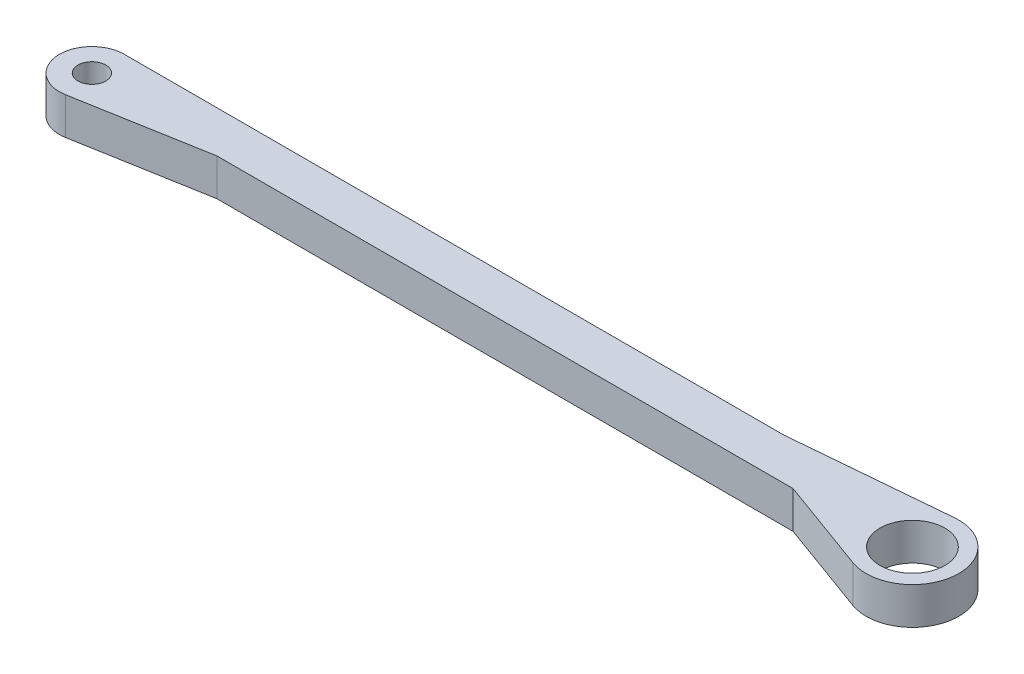
ISO-10303-21;
HEADER;
FILE_DESCRIPTION(('STEP AP214'),'2;1');
FILE_NAME('part.step','',(''),(''),'','','');
FILE_SCHEMA(('AUTOMOTIVE_DESIGN { 1 0 10303 214 1 1 1 1 }'));
ENDSEC;
DATA;
#1=APPLICATION_CONTEXT('core data for automotive mechanical design processes');
#2=APPLICATION_PROTOCOL_DEFINITION('international standard','automotive_design',2000,#1);
#3=PRODUCT_CONTEXT('',#1,'mechanical');
#4=PRODUCT('Part','Part','',(#3));
#5=PRODUCT_RELATED_PRODUCT_CATEGORY('part','',(#4));
#6=PRODUCT_DEFINITION_FORMATION('','',#4);
#7=PRODUCT_DEFINITION_CONTEXT('part definition',#1,'design');
#8=PRODUCT_DEFINITION('design','',#6,#7);
#9=PRODUCT_DEFINITION_SHAPE('','',#8);
#10=(LENGTH_UNIT() NAMED_UNIT(*) SI_UNIT(.MILLI.,.METRE.));
#11=(NAMED_UNIT(*) PLANE_ANGLE_UNIT() SI_UNIT($,.RADIAN.));
#12=(NAMED_UNIT(*) SI_UNIT($,.STERADIAN.) SOLID_ANGLE_UNIT());
#13=UNCERTAINTY_MEASURE_WITH_UNIT(LENGTH_MEASURE(1.E-05),#10,'distance_accuracy_value','');
#14=(GEOMETRIC_REPRESENTATION_CONTEXT(3) GLOBAL_UNCERTAINTY_ASSIGNED_CONTEXT((#13)) GLOBAL_UNIT_ASSIGNED_CONTEXT((#10,
#11,#12)) REPRESENTATION_CONTEXT('',''));
#15=CARTESIAN_POINT('',(0.,0.,0.));
#16=DIRECTION('',(0.,0.,1.));
#17=DIRECTION('',(1.,0.,0.));
#18=AXIS2_PLACEMENT_3D('',#15,#16,#17);
#19=CARTESIAN_POINT('',(17.2848653507131,8.,-47.4897772493988));
#20=DIRECTION('',(-0.342020143325663,0.,0.939692620785911));
#21=DIRECTION('',(0.939692620785911,0.,0.342020143325663));
#22=AXIS2_PLACEMENT_3D('',#19,#20,#21);
#23=PLANE('',#22);
#24=DIRECTION('',(-0.939692620785911,0.,-0.342020143325663));
#25=VECTOR('',#24,1.);
#26=CARTESIAN_POINT('',(17.2848653507131,0.,-47.4897772493988));
#27=LINE('',#26,#25);
#28=CARTESIAN_POINT('',(173.579798566743,0.,9.39692620785912));
#29=VERTEX_POINT('',#28);
#30=CARTESIAN_POINT('',(153.256910837278,0.,2.));
#31=VERTEX_POINT('',#30);
#32=EDGE_CURVE('E148',#29,#31,#27,.T.);
#33=ORIENTED_EDGE('',*,*,#32,.F.);
#34=DIRECTION('',(0.,-1.,0.));
#35=VECTOR('',#34,1.);
#36=CARTESIAN_POINT('',(173.579798566743,8.,9.39692620785912));
#37=LINE('',#36,#35);
#38=CARTESIAN_POINT('',(173.579798566743,8.,9.39692620785912));
#39=VERTEX_POINT('',#38);
#40=EDGE_CURVE('E11',#39,#29,#37,.T.);
#41=ORIENTED_EDGE('',*,*,#40,.F.);
#42=DIRECTION('',(-0.939692620785911,0.,-0.342020143325663));
#43=VECTOR('',#42,1.);
#44=CARTESIAN_POINT('',(17.2848653507131,8.,-47.4897772493988));
#45=LINE('',#44,#43);
#46=CARTESIAN_POINT('',(153.256910837278,8.,2.));
#47=VERTEX_POINT('',#46);
#48=EDGE_CURVE('E179',#39,#47,#45,.T.);
#49=ORIENTED_EDGE('',*,*,#48,.T.);
#50=DIRECTION('',(0.,-1.,0.));
#51=VECTOR('',#50,1.);
#52=CARTESIAN_POINT('',(153.256910837278,8.,2.));
#53=LINE('',#52,#51);
#54=EDGE_CURVE('E95',#47,#31,#53,.T.);
#55=ORIENTED_EDGE('',*,*,#54,.T.);
#56=EDGE_LOOP('',(#33,#41,#49,#55));
#57=FACE_BOUND('',#56,.T.);
#58=ADVANCED_FACE('F47',(#57),#23,.T.);
#59=CARTESIAN_POINT('',(177.,8.,0.));
#60=DIRECTION('',(0.,-1.,0.));
#61=DIRECTION('',(0.,0.,-1.));
#62=AXIS2_PLACEMENT_3D('',#59,#60,#61);
#63=CYLINDRICAL_SURFACE('',#62,10.);
#64=CARTESIAN_POINT('',(177.,0.,0.));
#65=DIRECTION('',(0.,1.,0.));
#66=DIRECTION('',(0.,0.,1.));
#67=AXIS2_PLACEMENT_3D('',#64,#65,#66);
#68=CIRCLE('',#67,10.);
#69=CARTESIAN_POINT('',(176.128442572523,0.,-9.96194698091746));
#70=VERTEX_POINT('',#69);
#71=EDGE_CURVE('E152',#29,#70,#68,.T.);
#72=ORIENTED_EDGE('',*,*,#71,.T.);
#73=DIRECTION('',(0.,-1.,0.));
#74=VECTOR('',#73,1.);
#75=CARTESIAN_POINT('',(176.128442572523,8.,-9.96194698091746));
#76=LINE('',#75,#74);
#77=CARTESIAN_POINT('',(176.128442572523,8.,-9.96194698091746));
#78=VERTEX_POINT('',#77);
#79=EDGE_CURVE('E56',#78,#70,#76,.T.);
#80=ORIENTED_EDGE('',*,*,#79,.F.);
#81=CARTESIAN_POINT('',(177.,8.,0.));
#82=DIRECTION('',(0.,1.,0.));
#83=DIRECTION('',(0.,0.,1.));
#84=AXIS2_PLACEMENT_3D('',#81,#82,#83);
#85=CIRCLE('',#84,10.);
#86=EDGE_CURVE('E207',#39,#78,#85,.T.);
#87=ORIENTED_EDGE('',*,*,#86,.F.);
#88=ORIENTED_EDGE('',*,*,#40,.T.);
#89=EDGE_LOOP('',(#72,#80,#87,#88));
#90=FACE_BOUND('',#89,.T.);
#91=ADVANCED_FACE('F213',(#90),#63,.T.);
#92=CARTESIAN_POINT('',(0.472956430942866,8.,5.40591674260471));
#93=DIRECTION('',(0.0871557427476515,0.,0.996194698091746));
#94=DIRECTION('',(0.996194698091746,0.,-0.0871557427476515));
#95=AXIS2_PLACEMENT_3D('',#92,#93,#94);
#96=PLANE('',#95);
#97=DIRECTION('',(-0.996194698091746,0.,0.0871557427476515));
#98=VECTOR('',#97,1.);
#99=CARTESIAN_POINT('',(0.472956430942866,0.,5.40591674260471));
#100=LINE('',#99,#98);
#101=CARTESIAN_POINT('',(142.273233662628,0.,-7.));
#102=VERTEX_POINT('',#101);
#103=EDGE_CURVE('E155',#70,#102,#100,.T.);
#104=ORIENTED_EDGE('',*,*,#103,.T.);
#105=DIRECTION('',(0.,-1.,0.));
#106=VECTOR('',#105,1.);
#107=CARTESIAN_POINT('',(142.273233662628,8.,-7.));
#108=LINE('',#107,#106);
#109=CARTESIAN_POINT('',(142.273233662628,8.,-7.));
#110=VERTEX_POINT('',#109);
#111=EDGE_CURVE('E186',#110,#102,#108,.T.);
#112=ORIENTED_EDGE('',*,*,#111,.F.);
#113=DIRECTION('',(-0.996194698091746,0.,0.0871557427476515));
#114=VECTOR('',#113,1.);
#115=CARTESIAN_POINT('',(0.472956430942866,8.,5.40591674260471));
#116=LINE('',#115,#114);
#117=EDGE_CURVE('E196',#78,#110,#116,.T.);
#118=ORIENTED_EDGE('',*,*,#117,.F.);
#119=ORIENTED_EDGE('',*,*,#79,.T.);
#120=EDGE_LOOP('',(#104,#112,#118,#119));
#121=FACE_BOUND('',#120,.T.);
#122=ADVANCED_FACE('F194',(#121),#96,.F.);
#123=CARTESIAN_POINT('',(0.,8.,-7.));
#124=DIRECTION('',(0.,0.,-1.));
#125=DIRECTION('',(-1.,0.,0.));
#126=AXIS2_PLACEMENT_3D('',#123,#124,#125);
#127=PLANE('',#126);
#128=DIRECTION('',(1.,0.,0.));
#129=VECTOR('',#128,1.);
#130=CARTESIAN_POINT('',(0.,0.,-7.));
#131=LINE('',#130,#129);
#132=CARTESIAN_POINT('',(0.,0.,-7.));
#133=VERTEX_POINT('',#132);
#134=EDGE_CURVE('E159',#133,#102,#131,.T.);
#135=ORIENTED_EDGE('',*,*,#134,.F.);
#136=DIRECTION('',(0.,-1.,0.));
#137=VECTOR('',#136,1.);
#138=CARTESIAN_POINT('',(0.,8.,-7.));
#139=LINE('',#138,#137);
#140=CARTESIAN_POINT('',(0.,8.,-7.));
#141=VERTEX_POINT('',#140);
#142=EDGE_CURVE('E131',#141,#133,#139,.T.);
#143=ORIENTED_EDGE('',*,*,#142,.F.);
#144=DIRECTION('',(1.,0.,0.));
#145=VECTOR('',#144,1.);
#146=CARTESIAN_POINT('',(0.,8.,-7.));
#147=LINE('',#146,#145);
#148=EDGE_CURVE('E118',#141,#110,#147,.T.);
#149=ORIENTED_EDGE('',*,*,#148,.T.);
#150=ORIENTED_EDGE('',*,*,#111,.T.);
#151=EDGE_LOOP('',(#135,#143,#149,#150));
#152=FACE_BOUND('',#151,.T.);
#153=ADVANCED_FACE('F204',(#152),#127,.T.);
#154=CARTESIAN_POINT('',(0.,8.,0.));
#155=DIRECTION('',(0.,-1.,0.));
#156=DIRECTION('',(0.,0.,-1.));
#157=AXIS2_PLACEMENT_3D('',#154,#155,#156);
#158=CYLINDRICAL_SURFACE('',#157,7.);
#159=CARTESIAN_POINT('',(0.,0.,0.));
#160=DIRECTION('',(0.,1.,0.));
#161=DIRECTION('',(0.,0.,1.));
#162=AXIS2_PLACEMENT_3D('',#159,#160,#161);
#163=CIRCLE('',#162,7.);
#164=CARTESIAN_POINT('',(1.21553724366847,0.,6.89365427108546));
#165=VERTEX_POINT('',#164);
#166=EDGE_CURVE('E126',#133,#165,#163,.T.);
#167=ORIENTED_EDGE('',*,*,#166,.T.);
#168=DIRECTION('',(0.,-1.,0.));
#169=VECTOR('',#168,1.);
#170=CARTESIAN_POINT('',(1.21553724366847,8.,6.89365427108546));
#171=LINE('',#170,#169);
#172=CARTESIAN_POINT('',(1.21553724366847,8.,6.89365427108546));
#173=VERTEX_POINT('',#172);
#174=EDGE_CURVE('E123',#173,#165,#171,.T.);
#175=ORIENTED_EDGE('',*,*,#174,.F.);
#176=CARTESIAN_POINT('',(0.,8.,0.));
#177=DIRECTION('',(0.,1.,0.));
#178=DIRECTION('',(0.,0.,1.));
#179=AXIS2_PLACEMENT_3D('',#176,#177,#178);
#180=CIRCLE('',#179,7.);
#181=EDGE_CURVE('E111',#141,#173,#180,.T.);
#182=ORIENTED_EDGE('',*,*,#181,.F.);
#183=ORIENTED_EDGE('',*,*,#142,.T.);
#184=EDGE_LOOP('',(#167,#175,#182,#183));
#185=FACE_BOUND('',#184,.T.);
#186=ADVANCED_FACE('F124',(#185),#158,.T.);
#187=CARTESIAN_POINT('',(1.21553724366847,8.,6.89365427108546));
#188=DIRECTION('',(0.173648177666924,0.,0.984807753012209));
#189=DIRECTION('',(0.984807753012209,0.,-0.173648177666924));
#190=AXIS2_PLACEMENT_3D('',#187,#188,#189);
#191=PLANE('',#190);
#192=DIRECTION('',(-0.984807753012209,0.,0.173648177666924));
#193=VECTOR('',#192,1.);
#194=CARTESIAN_POINT('',(1.21553724366847,0.,6.89365427108546));
#195=LINE('',#194,#193);
#196=CARTESIAN_POINT('',(28.9688297427711,0.,2.));
#197=VERTEX_POINT('',#196);
#198=EDGE_CURVE('E165',#197,#165,#195,.T.);
#199=ORIENTED_EDGE('',*,*,#198,.F.);
#200=DIRECTION('',(0.,-1.,0.));
#201=VECTOR('',#200,1.);
#202=CARTESIAN_POINT('',(28.9688297427711,8.,2.));
#203=LINE('',#202,#201);
#204=CARTESIAN_POINT('',(28.9688297427711,8.,2.));
#205=VERTEX_POINT('',#204);
#206=EDGE_CURVE('E88',#205,#197,#203,.T.);
#207=ORIENTED_EDGE('',*,*,#206,.F.);
#208=DIRECTION('',(-0.984807753012209,0.,0.173648177666924));
#209=VECTOR('',#208,1.);
#210=CARTESIAN_POINT('',(1.21553724366847,8.,6.89365427108546));
#211=LINE('',#210,#209);
#212=EDGE_CURVE('E116',#205,#173,#211,.T.);
#213=ORIENTED_EDGE('',*,*,#212,.T.);
#214=ORIENTED_EDGE('',*,*,#174,.T.);
#215=EDGE_LOOP('',(#199,#207,#213,#214));
#216=FACE_BOUND('',#215,.T.);
#217=ADVANCED_FACE('F133',(#216),#191,.T.);
#218=CARTESIAN_POINT('',(0.,8.,0.));
#219=DIRECTION('',(0.,-1.,0.));
#220=DIRECTION('',(0.,0.,-1.));
#221=AXIS2_PLACEMENT_3D('',#218,#219,#220);
#222=CYLINDRICAL_SURFACE('',#221,3.);
#223=CARTESIAN_POINT('',(0.,8.,0.));
#224=DIRECTION('',(0.,1.,0.));
#225=DIRECTION('',(0.,0.,1.));
#226=AXIS2_PLACEMENT_3D('',#223,#224,#225);
#227=CIRCLE('',#226,3.);
#228=CARTESIAN_POINT('',(0.,8.,3.));
#229=VERTEX_POINT('',#228);
#230=EDGE_CURVE('E137',#229,#229,#227,.T.);
#231=ORIENTED_EDGE('',*,*,#230,.T.);
#232=EDGE_LOOP('',(#231));
#233=FACE_BOUND('',#232,.T.);
#234=CARTESIAN_POINT('',(0.,0.,0.));
#235=DIRECTION('',(0.,1.,0.));
#236=DIRECTION('',(0.,0.,1.));
#237=AXIS2_PLACEMENT_3D('',#234,#235,#236);
#238=CIRCLE('',#237,3.);
#239=CARTESIAN_POINT('',(0.,0.,3.));
#240=VERTEX_POINT('',#239);
#241=EDGE_CURVE('E171',#240,#240,#238,.T.);
#242=ORIENTED_EDGE('',*,*,#241,.F.);
#243=EDGE_LOOP('',(#242));
#244=FACE_BOUND('',#243,.T.);
#245=ADVANCED_FACE('F227',(#233,#244),#222,.F.);
#246=CARTESIAN_POINT('',(0.,8.,2.));
#247=DIRECTION('',(0.,0.,-1.));
#248=DIRECTION('',(-1.,0.,0.));
#249=AXIS2_PLACEMENT_3D('',#246,#247,#248);
#250=PLANE('',#249);
#251=DIRECTION('',(1.,0.,0.));
#252=VECTOR('',#251,1.);
#253=CARTESIAN_POINT('',(0.,0.,2.));
#254=LINE('',#253,#252);
#255=EDGE_CURVE('E168',#197,#31,#254,.T.);
#256=ORIENTED_EDGE('',*,*,#255,.T.);
#257=ORIENTED_EDGE('',*,*,#54,.F.);
#258=DIRECTION('',(1.,0.,0.));
#259=VECTOR('',#258,1.);
#260=CARTESIAN_POINT('',(0.,8.,2.));
#261=LINE('',#260,#259);
#262=EDGE_CURVE('E64',#205,#47,#261,.T.);
#263=ORIENTED_EDGE('',*,*,#262,.F.);
#264=ORIENTED_EDGE('',*,*,#206,.T.);
#265=EDGE_LOOP('',(#256,#257,#263,#264));
#266=FACE_BOUND('',#265,.T.);
#267=ADVANCED_FACE('F228',(#266),#250,.F.);
#268=CARTESIAN_POINT('',(177.,8.,0.));
#269=DIRECTION('',(0.,-1.,0.));
#270=DIRECTION('',(0.,0.,-1.));
#271=AXIS2_PLACEMENT_3D('',#268,#269,#270);
#272=CYLINDRICAL_SURFACE('',#271,7.00000000000001);
#273=CARTESIAN_POINT('',(177.,8.,0.));
#274=DIRECTION('',(0.,1.,0.));
#275=DIRECTION('',(0.,0.,1.));
#276=AXIS2_PLACEMENT_3D('',#273,#274,#275);
#277=CIRCLE('',#276,7.00000000000001);
#278=CARTESIAN_POINT('',(177.,8.,7.00000000000001));
#279=VERTEX_POINT('',#278);
#280=EDGE_CURVE('E144',#279,#279,#277,.T.);
#281=ORIENTED_EDGE('',*,*,#280,.T.);
#282=EDGE_LOOP('',(#281));
#283=FACE_BOUND('',#282,.T.);
#284=CARTESIAN_POINT('',(177.,0.,0.));
#285=DIRECTION('',(0.,1.,0.));
#286=DIRECTION('',(0.,0.,1.));
#287=AXIS2_PLACEMENT_3D('',#284,#285,#286);
#288=CIRCLE('',#287,7.00000000000001);
#289=CARTESIAN_POINT('',(177.,0.,7.00000000000001));
#290=VERTEX_POINT('',#289);
#291=EDGE_CURVE('E175',#290,#290,#288,.T.);
#292=ORIENTED_EDGE('',*,*,#291,.F.);
#293=EDGE_LOOP('',(#292));
#294=FACE_BOUND('',#293,.T.);
#295=ADVANCED_FACE('F231',(#283,#294),#272,.F.);
#296=CARTESIAN_POINT('',(0.,8.,0.));
#297=DIRECTION('',(0.,1.,0.));
#298=DIRECTION('',(0.,0.,1.));
#299=AXIS2_PLACEMENT_3D('',#296,#297,#298);
#300=PLANE('',#299);
#301=ORIENTED_EDGE('',*,*,#48,.F.);
#302=ORIENTED_EDGE('',*,*,#86,.T.);
#303=ORIENTED_EDGE('',*,*,#117,.T.);
#304=ORIENTED_EDGE('',*,*,#148,.F.);
#305=ORIENTED_EDGE('',*,*,#181,.T.);
#306=ORIENTED_EDGE('',*,*,#212,.F.);
#307=ORIENTED_EDGE('',*,*,#262,.T.);
#308=EDGE_LOOP('',(#301,#302,#303,#304,#305,#306,#307));
#309=FACE_BOUND('',#308,.T.);
#310=ORIENTED_EDGE('',*,*,#230,.F.);
#311=EDGE_LOOP('',(#310));
#312=FACE_BOUND('',#311,.T.);
#313=ORIENTED_EDGE('',*,*,#280,.F.);
#314=EDGE_LOOP('',(#313));
#315=FACE_BOUND('',#314,.T.);
#316=ADVANCED_FACE('F113',(#309,#312,#315),#300,.T.);
#317=CARTESIAN_POINT('',(0.,0.,0.));
#318=DIRECTION('',(0.,1.,0.));
#319=DIRECTION('',(0.,0.,1.));
#320=AXIS2_PLACEMENT_3D('',#317,#318,#319);
#321=PLANE('',#320);
#322=ORIENTED_EDGE('',*,*,#32,.T.);
#323=ORIENTED_EDGE('',*,*,#255,.F.);
#324=ORIENTED_EDGE('',*,*,#198,.T.);
#325=ORIENTED_EDGE('',*,*,#166,.F.);
#326=ORIENTED_EDGE('',*,*,#134,.T.);
#327=ORIENTED_EDGE('',*,*,#103,.F.);
#328=ORIENTED_EDGE('',*,*,#71,.F.);
#329=EDGE_LOOP('',(#322,#323,#324,#325,#326,#327,#328));
#330=FACE_BOUND('',#329,.T.);
#331=ORIENTED_EDGE('',*,*,#241,.T.);
#332=EDGE_LOOP('',(#331));
#333=FACE_BOUND('',#332,.T.);
#334=ORIENTED_EDGE('',*,*,#291,.T.);
#335=EDGE_LOOP('',(#334));
#336=FACE_BOUND('',#335,.T.);
#337=ADVANCED_FACE('F200',(#330,#333,#336),#321,.F.);
#338=CLOSED_SHELL('',(#58,#91,#122,#153,#186,#217,#245,#267,#295,#316,#337));
#339=MANIFOLD_SOLID_BREP('B2',#338);
#340=ADVANCED_BREP_SHAPE_REPRESENTATION('',(#18,#339),#14);
#341=SHAPE_DEFINITION_REPRESENTATION(#9,#340);
ENDSEC;
END-ISO-10303-21;
